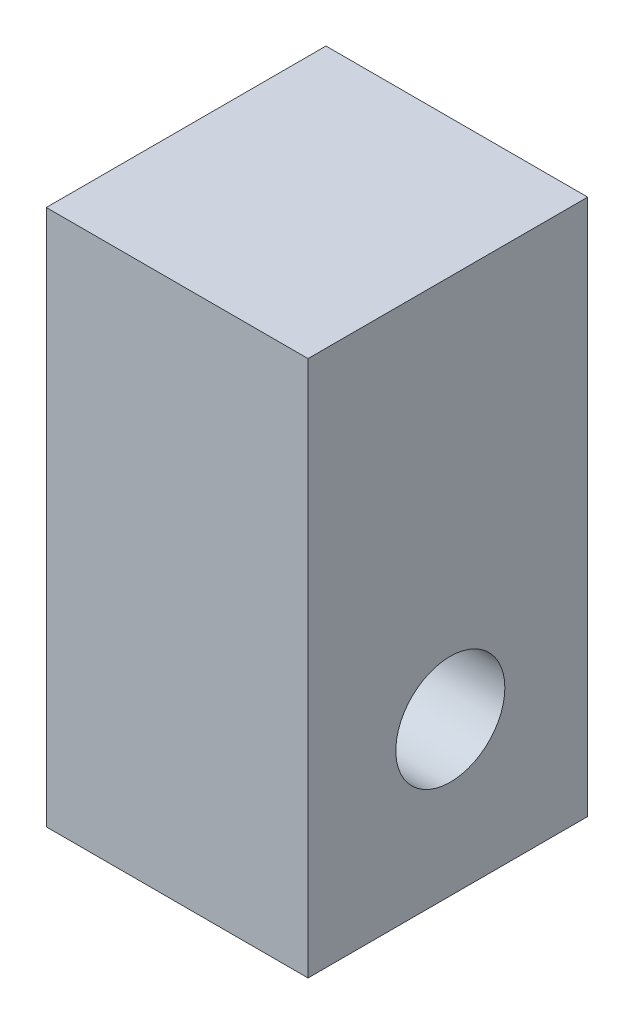
ISO-10303-21;
HEADER;
FILE_DESCRIPTION(('STEP AP214'),'2;1');
FILE_NAME('part.step','',(''),(''),'','','');
FILE_SCHEMA(('AUTOMOTIVE_DESIGN { 1 0 10303 214 1 1 1 1 }'));
ENDSEC;
DATA;
#1=APPLICATION_CONTEXT('core data for automotive mechanical design processes');
#2=APPLICATION_PROTOCOL_DEFINITION('international standard','automotive_design',2000,#1);
#3=PRODUCT_CONTEXT('',#1,'mechanical');
#4=PRODUCT('Part','Part','',(#3));
#5=PRODUCT_RELATED_PRODUCT_CATEGORY('part','',(#4));
#6=PRODUCT_DEFINITION_FORMATION('','',#4);
#7=PRODUCT_DEFINITION_CONTEXT('part definition',#1,'design');
#8=PRODUCT_DEFINITION('design','',#6,#7);
#9=PRODUCT_DEFINITION_SHAPE('','',#8);
#10=(LENGTH_UNIT() NAMED_UNIT(*) SI_UNIT(.MILLI.,.METRE.));
#11=(NAMED_UNIT(*) PLANE_ANGLE_UNIT() SI_UNIT($,.RADIAN.));
#12=(NAMED_UNIT(*) SI_UNIT($,.STERADIAN.) SOLID_ANGLE_UNIT());
#13=UNCERTAINTY_MEASURE_WITH_UNIT(LENGTH_MEASURE(1.E-05),#10,'distance_accuracy_value','');
#14=(GEOMETRIC_REPRESENTATION_CONTEXT(3) GLOBAL_UNCERTAINTY_ASSIGNED_CONTEXT((#13)) GLOBAL_UNIT_ASSIGNED_CONTEXT((#10,
#11,#12)) REPRESENTATION_CONTEXT('',''));
#15=CARTESIAN_POINT('',(0.,0.,0.));
#16=DIRECTION('',(0.,0.,1.));
#17=DIRECTION('',(1.,0.,0.));
#18=AXIS2_PLACEMENT_3D('',#15,#16,#17);
#19=CARTESIAN_POINT('',(-4.01,300.162147955684,27.3930893356429));
#20=DIRECTION('',(0.,1.,0.));
#21=DIRECTION('',(0.,0.,1.));
#22=AXIS2_PLACEMENT_3D('',#19,#20,#21);
#23=PLANE('',#22);
#24=DIRECTION('',(1.,0.,0.));
#25=VECTOR('',#24,1.);
#26=CARTESIAN_POINT('',(8.,300.162147955684,27.4030893356429));
#27=LINE('',#26,#25);
#28=CARTESIAN_POINT('',(-4.,300.162147955684,27.4030893356429));
#29=VERTEX_POINT('',#28);
#30=CARTESIAN_POINT('',(20.,300.162147955684,27.4030893356429));
#31=VERTEX_POINT('',#30);
#32=EDGE_CURVE('E121',#29,#31,#27,.T.);
#33=ORIENTED_EDGE('',*,*,#32,.F.);
#34=DIRECTION('',(0.,0.,-1.));
#35=VECTOR('',#34,1.);
#36=CARTESIAN_POINT('',(-4.,300.162147955684,40.2260139648698));
#37=LINE('',#36,#35);
#38=CARTESIAN_POINT('',(-4.,300.162147955684,53.0489385940967));
#39=VERTEX_POINT('',#38);
#40=EDGE_CURVE('E138',#39,#29,#37,.T.);
#41=ORIENTED_EDGE('',*,*,#40,.F.);
#42=DIRECTION('',(-1.,0.,0.));
#43=VECTOR('',#42,1.);
#44=CARTESIAN_POINT('',(8.,300.162147955684,53.0489385940967));
#45=LINE('',#44,#43);
#46=CARTESIAN_POINT('',(20.,300.162147955684,53.0489385940967));
#47=VERTEX_POINT('',#46);
#48=EDGE_CURVE('E99',#47,#39,#45,.T.);
#49=ORIENTED_EDGE('',*,*,#48,.F.);
#50=DIRECTION('',(0.,0.,1.));
#51=VECTOR('',#50,1.);
#52=CARTESIAN_POINT('',(20.,300.162147955684,40.2260139648698));
#53=LINE('',#52,#51);
#54=EDGE_CURVE('E100',#31,#47,#53,.T.);
#55=ORIENTED_EDGE('',*,*,#54,.F.);
#56=EDGE_LOOP('',(#33,#41,#49,#55));
#57=FACE_BOUND('',#56,.T.);
#58=ADVANCED_FACE('F16',(#57),#23,.T.);
#59=CARTESIAN_POINT('',(-4.,265.,40.));
#60=DIRECTION('',(1.,0.,0.));
#61=DIRECTION('',(0.,0.,-1.));
#62=AXIS2_PLACEMENT_3D('',#59,#60,#61);
#63=CYLINDRICAL_SURFACE('',#62,5.);
#64=CARTESIAN_POINT('',(-4.,265.,40.));
#65=DIRECTION('',(1.,0.,0.));
#66=DIRECTION('',(0.,0.,-1.));
#67=AXIS2_PLACEMENT_3D('',#64,#65,#66);
#68=CIRCLE('',#67,5.);
#69=CARTESIAN_POINT('',(-4.,265.,35.));
#70=VERTEX_POINT('',#69);
#71=EDGE_CURVE('E23',#70,#70,#68,.T.);
#72=ORIENTED_EDGE('',*,*,#71,.F.);
#73=EDGE_LOOP('',(#72));
#74=FACE_BOUND('',#73,.T.);
#75=CARTESIAN_POINT('',(4.,265.,40.));
#76=DIRECTION('',(1.,0.,0.));
#77=DIRECTION('',(0.,0.,-1.));
#78=AXIS2_PLACEMENT_3D('',#75,#76,#77);
#79=CIRCLE('',#78,5.);
#80=CARTESIAN_POINT('',(4.,265.,35.));
#81=VERTEX_POINT('',#80);
#82=EDGE_CURVE('E69',#81,#81,#79,.F.);
#83=ORIENTED_EDGE('',*,*,#82,.F.);
#84=EDGE_LOOP('',(#83));
#85=FACE_BOUND('',#84,.T.);
#86=ADVANCED_FACE('F250',(#74,#85),#63,.F.);
#87=CARTESIAN_POINT('',(-4.,300.172147955684,27.3930893356429));
#88=DIRECTION('',(-1.,0.,0.));
#89=DIRECTION('',(0.,-1.,0.));
#90=AXIS2_PLACEMENT_3D('',#87,#88,#89);
#91=PLANE('',#90);
#92=ORIENTED_EDGE('',*,*,#71,.T.);
#93=EDGE_LOOP('',(#92));
#94=FACE_BOUND('',#93,.T.);
#95=DIRECTION('',(0.,-1.,0.));
#96=VECTOR('',#95,1.);
#97=CARTESIAN_POINT('',(-4.,275.567230689508,53.0489385940967));
#98=LINE('',#97,#96);
#99=CARTESIAN_POINT('',(-4.,250.972313423332,53.0489385940967));
#100=VERTEX_POINT('',#99);
#101=EDGE_CURVE('E133',#39,#100,#98,.T.);
#102=ORIENTED_EDGE('',*,*,#101,.F.);
#103=ORIENTED_EDGE('',*,*,#40,.T.);
#104=DIRECTION('',(0.,1.,0.));
#105=VECTOR('',#104,1.);
#106=CARTESIAN_POINT('',(-4.,275.567230689508,27.4030893356429));
#107=LINE('',#106,#105);
#108=CARTESIAN_POINT('',(-4.,250.972313423332,27.4030893356429));
#109=VERTEX_POINT('',#108);
#110=EDGE_CURVE('E111',#109,#29,#107,.T.);
#111=ORIENTED_EDGE('',*,*,#110,.F.);
#112=DIRECTION('',(0.,0.,-1.));
#113=VECTOR('',#112,1.);
#114=CARTESIAN_POINT('',(-4.,250.972313423332,40.2260139648698));
#115=LINE('',#114,#113);
#116=EDGE_CURVE('E116',#100,#109,#115,.T.);
#117=ORIENTED_EDGE('',*,*,#116,.F.);
#118=EDGE_LOOP('',(#102,#103,#111,#117));
#119=FACE_BOUND('',#118,.T.);
#120=ADVANCED_FACE('F242',(#94,#119),#91,.T.);
#121=CARTESIAN_POINT('',(-4.01,250.962313423332,27.4030893356429));
#122=DIRECTION('',(0.,0.,-1.));
#123=DIRECTION('',(0.,1.,0.));
#124=AXIS2_PLACEMENT_3D('',#121,#122,#123);
#125=PLANE('',#124);
#126=DIRECTION('',(1.,0.,0.));
#127=VECTOR('',#126,1.);
#128=CARTESIAN_POINT('',(8.,250.972313423332,27.4030893356429));
#129=LINE('',#128,#127);
#130=CARTESIAN_POINT('',(20.,250.972313423332,27.4030893356429));
#131=VERTEX_POINT('',#130);
#132=EDGE_CURVE('E105',#109,#131,#129,.T.);
#133=ORIENTED_EDGE('',*,*,#132,.F.);
#134=ORIENTED_EDGE('',*,*,#110,.T.);
#135=ORIENTED_EDGE('',*,*,#32,.T.);
#136=DIRECTION('',(0.,1.,0.));
#137=VECTOR('',#136,1.);
#138=CARTESIAN_POINT('',(20.,275.567230689508,27.4030893356429));
#139=LINE('',#138,#137);
#140=EDGE_CURVE('E108',#131,#31,#139,.T.);
#141=ORIENTED_EDGE('',*,*,#140,.F.);
#142=EDGE_LOOP('',(#133,#134,#135,#141));
#143=FACE_BOUND('',#142,.T.);
#144=ADVANCED_FACE('F208',(#143),#125,.T.);
#145=CARTESIAN_POINT('',(20.,250.962313423332,27.3930893356429));
#146=DIRECTION('',(1.,0.,0.));
#147=DIRECTION('',(0.,1.,0.));
#148=AXIS2_PLACEMENT_3D('',#145,#146,#147);
#149=PLANE('',#148);
#150=CARTESIAN_POINT('',(20.,265.,40.));
#151=DIRECTION('',(1.,0.,0.));
#152=DIRECTION('',(0.,0.,-1.));
#153=AXIS2_PLACEMENT_3D('',#150,#151,#152);
#154=CIRCLE('',#153,5.);
#155=CARTESIAN_POINT('',(20.,265.,35.));
#156=VERTEX_POINT('',#155);
#157=EDGE_CURVE('E88',#156,#156,#154,.T.);
#158=ORIENTED_EDGE('',*,*,#157,.F.);
#159=EDGE_LOOP('',(#158));
#160=FACE_BOUND('',#159,.T.);
#161=DIRECTION('',(0.,1.,0.));
#162=VECTOR('',#161,1.);
#163=CARTESIAN_POINT('',(20.,275.567230689508,53.0489385940967));
#164=LINE('',#163,#162);
#165=CARTESIAN_POINT('',(20.,250.972313423332,53.0489385940967));
#166=VERTEX_POINT('',#165);
#167=EDGE_CURVE('E96',#166,#47,#164,.T.);
#168=ORIENTED_EDGE('',*,*,#167,.F.);
#169=DIRECTION('',(0.,0.,1.));
#170=VECTOR('',#169,1.);
#171=CARTESIAN_POINT('',(20.,250.972313423332,40.2260139648698));
#172=LINE('',#171,#170);
#173=EDGE_CURVE('E93',#131,#166,#172,.T.);
#174=ORIENTED_EDGE('',*,*,#173,.F.);
#175=ORIENTED_EDGE('',*,*,#140,.T.);
#176=ORIENTED_EDGE('',*,*,#54,.T.);
#177=EDGE_LOOP('',(#168,#174,#175,#176));
#178=FACE_BOUND('',#177,.T.);
#179=ADVANCED_FACE('F204',(#160,#178),#149,.T.);
#180=CARTESIAN_POINT('',(-4.01,300.172147955684,53.0489385940967));
#181=DIRECTION('',(0.,0.,1.));
#182=DIRECTION('',(0.,-1.,0.));
#183=AXIS2_PLACEMENT_3D('',#180,#181,#182);
#184=PLANE('',#183);
#185=ORIENTED_EDGE('',*,*,#48,.T.);
#186=ORIENTED_EDGE('',*,*,#101,.T.);
#187=DIRECTION('',(-1.,0.,0.));
#188=VECTOR('',#187,1.);
#189=CARTESIAN_POINT('',(8.,250.972313423332,53.0489385940967));
#190=LINE('',#189,#188);
#191=CARTESIAN_POINT('',(4.,250.972313423332,53.0489385940967));
#192=VERTEX_POINT('',#191);
#193=EDGE_CURVE('E126',#192,#100,#190,.T.);
#194=ORIENTED_EDGE('',*,*,#193,.F.);
#195=DIRECTION('',(-1.,0.,0.));
#196=VECTOR('',#195,1.);
#197=CARTESIAN_POINT('',(8.,250.972313423332,53.0489385940967));
#198=LINE('',#197,#196);
#199=CARTESIAN_POINT('',(12.,250.972313423332,53.0489385940967));
#200=VERTEX_POINT('',#199);
#201=EDGE_CURVE('E65',#200,#192,#198,.T.);
#202=ORIENTED_EDGE('',*,*,#201,.F.);
#203=DIRECTION('',(-1.,0.,0.));
#204=VECTOR('',#203,1.);
#205=CARTESIAN_POINT('',(8.,250.972313423332,53.0489385940967));
#206=LINE('',#205,#204);
#207=EDGE_CURVE('E89',#166,#200,#206,.T.);
#208=ORIENTED_EDGE('',*,*,#207,.F.);
#209=ORIENTED_EDGE('',*,*,#167,.T.);
#210=EDGE_LOOP('',(#185,#186,#194,#202,#208,#209));
#211=FACE_BOUND('',#210,.T.);
#212=ADVANCED_FACE('F207',(#211),#184,.T.);
#213=CARTESIAN_POINT('',(12.,265.,40.));
#214=DIRECTION('',(1.,0.,0.));
#215=DIRECTION('',(0.,0.,-1.));
#216=AXIS2_PLACEMENT_3D('',#213,#214,#215);
#217=CYLINDRICAL_SURFACE('',#216,5.);
#218=CARTESIAN_POINT('',(12.,265.,40.));
#219=DIRECTION('',(1.,0.,0.));
#220=DIRECTION('',(0.,0.,-1.));
#221=AXIS2_PLACEMENT_3D('',#218,#219,#220);
#222=CIRCLE('',#221,5.);
#223=CARTESIAN_POINT('',(12.,265.,35.));
#224=VERTEX_POINT('',#223);
#225=EDGE_CURVE('E77',#224,#224,#222,.T.);
#226=ORIENTED_EDGE('',*,*,#225,.F.);
#227=EDGE_LOOP('',(#226));
#228=FACE_BOUND('',#227,.T.);
#229=ORIENTED_EDGE('',*,*,#157,.T.);
#230=EDGE_LOOP('',(#229));
#231=FACE_BOUND('',#230,.T.);
#232=ADVANCED_FACE('F187',(#228,#231),#217,.F.);
#233=CARTESIAN_POINT('',(4.,250.972313423332,53.0489385940967));
#234=CARTESIAN_POINT('',(12.,250.972313423332,53.0489385940967));
#235=CARTESIAN_POINT('',(4.,251.094790735295,52.8726110395644));
#236=CARTESIAN_POINT('',(12.,251.094790735295,52.8726110395644));
#237=CARTESIAN_POINT('',(4.,251.355380041527,52.5270325787047));
#238=CARTESIAN_POINT('',(12.,251.355380041527,52.5270325787047));
#239=CARTESIAN_POINT('',(4.,251.793169050558,52.029895285908));
#240=CARTESIAN_POINT('',(12.,251.793169050558,52.029895285908));
#241=CARTESIAN_POINT('',(4.,252.472232609889,51.410201039541));
#242=CARTESIAN_POINT('',(12.,252.472232609889,51.410201039541));
#243=CARTESIAN_POINT('',(4.,253.489502120393,50.711823415706));
#244=CARTESIAN_POINT('',(12.,253.489502120393,50.711823415706));
#245=CARTESIAN_POINT('',(4.,254.68615991058,50.0946414134092));
#246=CARTESIAN_POINT('',(12.,254.68615991058,50.0946414134092));
#247=CARTESIAN_POINT('',(4.,256.069380306183,49.5619023118962));
#248=CARTESIAN_POINT('',(12.,256.069380306183,49.5619023118962));
#249=CARTESIAN_POINT('',(4.,257.63214241845,49.1104282813444));
#250=CARTESIAN_POINT('',(12.,257.63214241845,49.1104282813444));
#251=CARTESIAN_POINT('',(4.,259.358756991625,48.7331179722495));
#252=CARTESIAN_POINT('',(12.,259.358756991625,48.7331179722495));
#253=CARTESIAN_POINT('',(4.,261.232297648932,48.4223100831971));
#254=CARTESIAN_POINT('',(12.,261.232297648932,48.4223100831971));
#255=CARTESIAN_POINT('',(4.,262.837142115883,48.2216474276827));
#256=CARTESIAN_POINT('',(12.,262.837142115883,48.2216474276827));
#257=CARTESIAN_POINT('',(4.,264.096266137086,48.0962669014714));
#258=CARTESIAN_POINT('',(12.,264.096266137086,48.0962669014714));
#259=CARTESIAN_POINT('',(4.,264.959940571983,48.0236598518995));
#260=CARTESIAN_POINT('',(12.,264.959940571983,48.0236598518995));
#261=CARTESIAN_POINT('',(4.,265.397842686042,47.9901014509932));
#262=CARTESIAN_POINT('',(12.,265.397842686042,47.9901014509932));
#263=B_SPLINE_SURFACE_WITH_KNOTS('',5,1,((#233,#234),(#235,#236),(#237,#238),(#239,#240),(#241,
#242),(#243,#244),(#245,#246),(#247,#248),(#249,#250),(#251,#252),(#253,#254),(#255,#256),(#257,
#258),(#259,#260),(#261,#262)),.UNSPECIFIED.,.F.,.F.,.F.,(6,1,1,1,1,1,1,1,1,1,6),(2,2),(-1.,
-0.9,-0.8,-0.7,-0.6,-0.5,-0.4,-0.3,-0.2,-0.1,0.),(0.,0.8),.UNSPECIFIED.);
#264=CARTESIAN_POINT('',(12.,250.972313423332,53.0489385940967));
#265=CARTESIAN_POINT('',(12.,251.060682972925,52.9216961978627));
#266=CARTESIAN_POINT('',(12.,251.153382064024,52.7974997491512));
#267=CARTESIAN_POINT('',(12.,251.346506239264,52.5556655474179));
#268=CARTESIAN_POINT('',(12.,251.446915566369,52.4380152230266));
#269=CARTESIAN_POINT('',(12.,251.654822399127,52.209300361784));
#270=CARTESIAN_POINT('',(12.,251.762315594955,52.0982318972467));
#271=CARTESIAN_POINT('',(12.,251.981294151887,51.8850627086551));
#272=CARTESIAN_POINT('',(12.,252.092640457815,51.7828188267141));
#273=CARTESIAN_POINT('',(12.,252.320869453498,51.5846116264991));
#274=CARTESIAN_POINT('',(12.,252.437754638725,51.488651186426));
#275=CARTESIAN_POINT('',(12.,252.67640255375,51.3029652942458));
#276=CARTESIAN_POINT('',(12.,252.79816636025,51.2132412305768));
#277=CARTESIAN_POINT('',(12.,253.096439321411,51.0045770461902));
#278=CARTESIAN_POINT('',(12.,253.27504383675,50.8886244329777));
#279=CARTESIAN_POINT('',(12.,253.63919572653,50.6681441930101));
#280=CARTESIAN_POINT('',(12.,253.824745164665,50.5636199989915));
#281=CARTESIAN_POINT('',(12.,254.201430755041,50.3651857258049));
#282=CARTESIAN_POINT('',(12.,254.392567388068,50.2712765634776));
#283=CARTESIAN_POINT('',(12.,254.783040261384,50.0913926825453));
#284=CARTESIAN_POINT('',(12.,254.982463709501,50.0056083198371));
#285=CARTESIAN_POINT('',(12.,255.384871844638,49.8430227421529));
#286=CARTESIAN_POINT('',(12.,255.587855805788,49.7662197201073));
#287=CARTESIAN_POINT('',(12.,255.996611200248,49.6205249361439));
#288=CARTESIAN_POINT('',(12.,256.202382470507,49.5516327136812));
#289=CARTESIAN_POINT('',(12.,256.708817873633,49.3914474400918));
#290=CARTESIAN_POINT('',(12.,257.010681661162,49.3039515769273));
#291=CARTESIAN_POINT('',(12.,257.617666236751,49.1409318064363));
#292=CARTESIAN_POINT('',(12.,257.922787882907,49.0654111406831));
#293=CARTESIAN_POINT('',(12.,258.535601714421,48.9242921352921));
#294=CARTESIAN_POINT('',(12.,258.843296046906,48.8587031915117));
#295=CARTESIAN_POINT('',(12.,259.460648861408,48.7358960079846));
#296=CARTESIAN_POINT('',(12.,259.770308969302,48.6786860127979));
#297=CARTESIAN_POINT('',(12.,260.391066437594,48.5714454244102));
#298=CARTESIAN_POINT('',(12.,260.702164593641,48.5214194679024));
#299=CARTESIAN_POINT('',(12.,261.305452326418,48.430617607594));
#300=CARTESIAN_POINT('',(12.,261.597584195367,48.3894554868615));
#301=CARTESIAN_POINT('',(12.,262.182320666874,48.3120272370915));
#302=CARTESIAN_POINT('',(12.,262.47492489644,48.2757582790387));
#303=CARTESIAN_POINT('',(12.,263.06020987463,48.2076512739973));
#304=CARTESIAN_POINT('',(12.,263.352889876813,48.1758067842325));
#305=CARTESIAN_POINT('',(12.,263.937939114653,48.1161707132322));
#306=CARTESIAN_POINT('',(12.,264.230307366713,48.0883694346914));
#307=CARTESIAN_POINT('',(12.,264.814357111328,48.0365278746285));
#308=CARTESIAN_POINT('',(12.,265.106037475142,48.0124749000382));
#309=CARTESIAN_POINT('',(12.,265.397842686042,47.9901014509932));
#310=B_SPLINE_CURVE_WITH_KNOTS('',3,(#264,#265,#266,#267,#268,#269,#270,#271,#272,#273,#274,
#275,#276,#277,#278,#279,#280,#281,#282,#283,#284,#285,#286,#287,#288,#289,#290,#291,#292,#293,
#294,#295,#296,#297,#298,#299,#300,#301,#302,#303,#304,#305,#306,#307,#308,#309),.UNSPECIFIED.,
.F.,.F.,(4,2,2,2,2,2,2,2,2,2,2,2,2,2,2,2,2,2,2,2,2,2,4),(0.,0.46461922085901,0.928312976378586,
1.39172717961576,1.84498878019078,2.29845657051804,2.75202499757094,3.39035859100454,
4.02888339600757,4.66746330956328,5.31849141708117,5.96938830981534,6.62024728989887,
7.56278730010313,8.50558201307747,9.44926315361619,10.3938666898599,11.3390771743827,
12.2240848479435,13.1085786353022,13.9917706396458,14.8728081545285,15.7507941084636),.UNSPECIFIED.);
#311=CARTESIAN_POINT('',(12.,265.397842686042,47.9901014509932));
#312=VERTEX_POINT('',#311);
#313=EDGE_CURVE('E174',#200,#312,#310,.T.);
#314=CARTESIAN_POINT('',(4.,265.397842686042,47.9901014509932));
#315=CARTESIAN_POINT('',(4.,265.093385081342,48.0134466642958));
#316=CARTESIAN_POINT('',(4.,264.78906281593,48.0386180078685));
#317=CARTESIAN_POINT('',(4.,264.180366358286,48.0929791020582));
#318=CARTESIAN_POINT('',(4.,263.875992644722,48.1221742015023));
#319=CARTESIAN_POINT('',(4.,263.267449380577,48.1849127133049));
#320=CARTESIAN_POINT('',(4.,262.963280178713,48.2184595266914));
#321=CARTESIAN_POINT('',(4.,262.355416010964,48.2903404528707));
#322=CARTESIAN_POINT('',(4.,262.051721208209,48.3286759513105));
#323=CARTESIAN_POINT('',(4.,261.439562764455,48.4114311526202));
#324=CARTESIAN_POINT('',(4.,261.131112230466,48.4559483672944));
#325=CARTESIAN_POINT('',(4.,260.515273564281,48.551267681371));
#326=CARTESIAN_POINT('',(4.,260.207885136982,48.6020678614411));
#327=CARTESIAN_POINT('',(4.,259.594506230776,48.7109206335245));
#328=CARTESIAN_POINT('',(4.,259.288515271012,48.7689704996519));
#329=CARTESIAN_POINT('',(4.,258.678305782694,48.893575254759));
#330=CARTESIAN_POINT('',(4.,258.37408695496,48.9601286619051));
#331=CARTESIAN_POINT('',(4.,257.857685449615,49.0821666183739));
#332=CARTESIAN_POINT('',(4.,257.64490044595,49.1351009311991));
#333=CARTESIAN_POINT('',(4.,257.220815287827,49.2466826627867));
#334=CARTESIAN_POINT('',(4.,257.009515196204,49.3053303217706));
#335=CARTESIAN_POINT('',(4.,256.588782893065,49.4291541001055));
#336=CARTESIAN_POINT('',(4.,256.379351043239,49.4943314549574));
#337=CARTESIAN_POINT('',(4.,255.963481239759,49.6319584939402));
#338=CARTESIAN_POINT('',(4.,255.757036913766,49.7043888135543));
#339=CARTESIAN_POINT('',(4.,255.347314113107,49.8576880923369));
#340=CARTESIAN_POINT('',(4.,255.144035255743,49.938556022174));
#341=CARTESIAN_POINT('',(4.,254.741572666274,50.1098200286373));
#342=CARTESIAN_POINT('',(4.,254.542387900089,50.2002136630382));
#343=CARTESIAN_POINT('',(4.,254.127279994585,50.4022930005574));
#344=CARTESIAN_POINT('',(4.,253.911960084596,50.5152286902938));
#345=CARTESIAN_POINT('',(4.,253.489554500752,50.7555541161977));
#346=CARTESIAN_POINT('',(4.,253.282467045639,50.8829407023826));
#347=CARTESIAN_POINT('',(4.,252.879288427866,51.1528402056722));
#348=CARTESIAN_POINT('',(4.,252.683164121445,51.2953032884399));
#349=CARTESIAN_POINT('',(4.,252.30374696541,51.5962801723038));
#350=CARTESIAN_POINT('',(4.,252.120447966668,51.7547861911383));
#351=CARTESIAN_POINT('',(4.,251.764870834264,52.0922261231978));
#352=CARTESIAN_POINT('',(4.,251.592974647442,52.2715665833476));
#353=CARTESIAN_POINT('',(4.,251.349224841442,52.5533482842468));
#354=CARTESIAN_POINT('',(4.,251.270169517503,52.6496245501172));
#355=CARTESIAN_POINT('',(4.,251.117251073865,52.8462547934187));
#356=CARTESIAN_POINT('',(4.,251.043389347759,52.9466098539967));
#357=CARTESIAN_POINT('',(4.,250.972313423332,53.0489385940967));
#358=B_SPLINE_CURVE_WITH_KNOTS('',3,(#314,#315,#316,#317,#318,#319,#320,#321,#322,#323,#324,
#325,#326,#327,#328,#329,#330,#331,#332,#333,#334,#335,#336,#337,#338,#339,#340,#341,#342,#343,
#344,#345,#346,#347,#348,#349,#350,#351,#352,#353,#354,#355,#356,#357),.UNSPECIFIED.,.F.,.F.,(4,
2,2,2,2,2,2,2,2,2,2,2,2,2,2,2,2,2,2,2,2,4),(0.,0.916055376318095,1.83334043691703,
2.75134675875067,3.66961933159498,4.6045022364523,5.53910025364921,6.4733479135667,
7.40743299224568,8.06517813303569,8.72295094111293,9.38084844402943,10.0370340424195,
10.6931396839875,11.3490775188272,12.077992020182,12.8067479381551,13.5331660940599,
14.2592335457194,15.0031589353868,15.376729197689,15.7503993202742),.UNSPECIFIED.);
#359=CARTESIAN_POINT('',(4.,265.397842686042,47.9901014509932));
#360=VERTEX_POINT('',#359);
#361=EDGE_CURVE('E59',#360,#192,#358,.T.);
#362=DIRECTION('',(-1.,0.,0.));
#363=VECTOR('',#362,1.);
#364=CARTESIAN_POINT('',(8.,265.397842686042,47.9901014509932));
#365=LINE('',#364,#363);
#366=EDGE_CURVE('E64',#312,#360,#365,.T.);
#367=ORIENTED_EDGE('',*,*,#313,.F.);
#368=ORIENTED_EDGE('',*,*,#201,.T.);
#369=ORIENTED_EDGE('',*,*,#361,.F.);
#370=ORIENTED_EDGE('',*,*,#366,.F.);
#371=EDGE_LOOP('',(#367,#368,#369,#370));
#372=FACE_BOUND('',#371,.T.);
#373=ADVANCED_FACE('F62',(#372),#263,.T.);
#374=CARTESIAN_POINT('',(4.,250.962313423332,27.9041363123494));
#375=DIRECTION('',(1.,0.,0.));
#376=DIRECTION('',(0.,1.,0.));
#377=AXIS2_PLACEMENT_3D('',#374,#375,#376);
#378=PLANE('',#377);
#379=ORIENTED_EDGE('',*,*,#82,.T.);
#380=EDGE_LOOP('',(#379));
#381=FACE_BOUND('',#380,.T.);
#382=DIRECTION('',(0.,0.,1.));
#383=VECTOR('',#382,1.);
#384=CARTESIAN_POINT('',(4.,250.972313423332,40.2260139648698));
#385=LINE('',#384,#383);
#386=CARTESIAN_POINT('',(4.,250.972313423332,27.9141363123494));
#387=VERTEX_POINT('',#386);
#388=EDGE_CURVE('E86',#387,#192,#385,.T.);
#389=ORIENTED_EDGE('',*,*,#388,.F.);
#390=CARTESIAN_POINT('',(4.,265.140230113327,32.0012291247144));
#391=CARTESIAN_POINT('',(4.,264.843405105679,31.9880701521189));
#392=CARTESIAN_POINT('',(4.,264.546652799238,31.9731775767956));
#393=CARTESIAN_POINT('',(4.,263.953017594738,31.9396021909287));
#394=CARTESIAN_POINT('',(4.,263.656134945253,31.9209149987018));
#395=CARTESIAN_POINT('',(4.,263.062451844927,31.8794424582638));
#396=CARTESIAN_POINT('',(4.,262.765651585923,31.8566543431628));
#397=CARTESIAN_POINT('',(4.,262.172355265388,31.8065748721459));
#398=CARTESIAN_POINT('',(4.,261.875859297016,31.7792824061602));
#399=CARTESIAN_POINT('',(4.,261.279547946937,31.7193034340151));
#400=CARTESIAN_POINT('',(4.,260.979739059687,31.6865519135707));
#401=CARTESIAN_POINT('',(4.,260.380887296293,31.6152426211558));
#402=CARTESIAN_POINT('',(4.,260.081844239217,31.5766863804881));
#403=CARTESIAN_POINT('',(4.,259.484784164785,31.4929139964596));
#404=CARTESIAN_POINT('',(4.,259.18676684856,31.4476999974942));
#405=CARTESIAN_POINT('',(4.,258.592042519089,31.3495182572144));
#406=CARTESIAN_POINT('',(4.,258.295335314952,31.2965516866648));
#407=CARTESIAN_POINT('',(4.,257.792942088819,31.1988236127938));
#408=CARTESIAN_POINT('',(4.,257.586799939611,31.1564072215867));
#409=CARTESIAN_POINT('',(4.,257.17560639226,31.0665228075137));
#410=CARTESIAN_POINT('',(4.,256.970555028874,31.0190546246696));
#411=CARTESIAN_POINT('',(4.,256.561828152039,30.9183813384644));
#412=CARTESIAN_POINT('',(4.,256.358152831135,30.8651754492177));
#413=CARTESIAN_POINT('',(4.,255.952807946253,30.7522973228656));
#414=CARTESIAN_POINT('',(4.,255.75113660558,30.692631501151));
#415=CARTESIAN_POINT('',(4.,255.350133946276,30.5659026012287));
#416=CARTESIAN_POINT('',(4.,255.150802440281,30.4988401198509));
#417=CARTESIAN_POINT('',(4.,254.755173761164,30.3563490154317));
#418=CARTESIAN_POINT('',(4.,254.558876146792,30.2809216222817));
#419=CARTESIAN_POINT('',(4.,254.124364582848,30.1018084851753));
#420=CARTESIAN_POINT('',(4.,253.88715767703,29.9956499187372));
#421=CARTESIAN_POINT('',(4.,253.420649320939,29.7672049744085));
#422=CARTESIAN_POINT('',(4.,253.191345992674,29.6449224615663));
#423=CARTESIAN_POINT('',(4.,252.743841219331,29.3831470460986));
#424=CARTESIAN_POINT('',(4.,252.52560221292,29.2437187717325));
#425=CARTESIAN_POINT('',(4.,252.102289616429,28.9462764214088));
#426=CARTESIAN_POINT('',(4.,251.897206512559,28.7882760156699));
#427=CARTESIAN_POINT('',(4.,251.571486906387,28.5112216608651));
#428=CARTESIAN_POINT('',(4.,251.446193876951,28.3976199877214));
#429=CARTESIAN_POINT('',(4.,251.203227148084,28.1620831615034));
#430=CARTESIAN_POINT('',(4.,251.08556910947,28.0401318725629));
#431=CARTESIAN_POINT('',(4.,250.972313423332,27.9141363123494));
#432=B_SPLINE_CURVE_WITH_KNOTS('',3,(#390,#391,#392,#393,#394,#395,#396,#397,#398,#399,#400,
#401,#402,#403,#404,#405,#406,#407,#408,#409,#410,#411,#412,#413,#414,#415,#416,#417,#418,#419,
#420,#421,#422,#423,#424,#425,#426,#427,#428,#429,#430,#431),.UNSPECIFIED.,.F.,.F.,(4,2,2,2,2,2,
2,2,2,2,2,2,2,2,2,2,2,2,2,2,4),(0.,0.891350701424741,1.78373656818481,2.67672679997498,
3.56993743328444,4.47466532374241,5.37915496109418,6.28335390632782,7.18741644338996,
7.81874574660699,8.45009504845519,9.08153093541666,9.71234539455481,10.3431089910099,
10.9737799690559,11.7528693976368,12.5317724101464,13.3078246296577,14.0833091629243,
14.5903375825238,15.0983751247547),.UNSPECIFIED.);
#433=CARTESIAN_POINT('',(4.,265.140230113327,32.0012291247144));
#434=VERTEX_POINT('',#433);
#435=EDGE_CURVE('E75',#434,#387,#432,.T.);
#436=ORIENTED_EDGE('',*,*,#435,.F.);
#437=CARTESIAN_POINT('',(4.,265.,39.9999999999996));
#438=DIRECTION('',(1.,0.,0.));
#439=DIRECTION('',(0.,0.,-1.));
#440=AXIS2_PLACEMENT_3D('',#437,#438,#439);
#441=CIRCLE('',#440,7.99999999999969);
#442=EDGE_CURVE('E72',#360,#434,#441,.F.);
#443=ORIENTED_EDGE('',*,*,#442,.F.);
#444=ORIENTED_EDGE('',*,*,#361,.T.);
#445=EDGE_LOOP('',(#389,#436,#443,#444));
#446=FACE_BOUND('',#445,.T.);
#447=ADVANCED_FACE('F73',(#381,#446),#378,.T.);
#448=CARTESIAN_POINT('',(-4.01,250.972313423332,53.0589385940967));
#449=DIRECTION('',(0.,-1.,0.));
#450=DIRECTION('',(0.,0.,-1.));
#451=AXIS2_PLACEMENT_3D('',#448,#449,#450);
#452=PLANE('',#451);
#453=DIRECTION('',(0.,0.,1.));
#454=VECTOR('',#453,1.);
#455=CARTESIAN_POINT('',(12.,250.972313423332,40.4815374532231));
#456=LINE('',#455,#454);
#457=CARTESIAN_POINT('',(12.,250.972313423332,27.9141363123494));
#458=VERTEX_POINT('',#457);
#459=EDGE_CURVE('E92',#458,#200,#456,.T.);
#460=ORIENTED_EDGE('',*,*,#459,.F.);
#461=DIRECTION('',(1.,0.,0.));
#462=VECTOR('',#461,1.);
#463=CARTESIAN_POINT('',(8.,250.972313423332,27.9141363123494));
#464=LINE('',#463,#462);
#465=EDGE_CURVE('E81',#387,#458,#464,.T.);
#466=ORIENTED_EDGE('',*,*,#465,.F.);
#467=ORIENTED_EDGE('',*,*,#388,.T.);
#468=ORIENTED_EDGE('',*,*,#193,.T.);
#469=ORIENTED_EDGE('',*,*,#116,.T.);
#470=ORIENTED_EDGE('',*,*,#132,.T.);
#471=ORIENTED_EDGE('',*,*,#173,.T.);
#472=ORIENTED_EDGE('',*,*,#207,.T.);
#473=EDGE_LOOP('',(#460,#466,#467,#468,#469,#470,#471,#472));
#474=FACE_BOUND('',#473,.T.);
#475=ADVANCED_FACE('F170',(#474),#452,.T.);
#476=CARTESIAN_POINT('',(12.,273.133576813266,27.9041363123494));
#477=DIRECTION('',(-1.,0.,0.));
#478=DIRECTION('',(0.,-1.,0.));
#479=AXIS2_PLACEMENT_3D('',#476,#477,#478);
#480=PLANE('',#479);
#481=ORIENTED_EDGE('',*,*,#225,.T.);
#482=EDGE_LOOP('',(#481));
#483=FACE_BOUND('',#482,.T.);
#484=ORIENTED_EDGE('',*,*,#459,.T.);
#485=ORIENTED_EDGE('',*,*,#313,.T.);
#486=CARTESIAN_POINT('',(12.,265.,39.9999999999996));
#487=DIRECTION('',(1.,0.,0.));
#488=DIRECTION('',(0.,0.,-1.));
#489=AXIS2_PLACEMENT_3D('',#486,#487,#488);
#490=CIRCLE('',#489,7.99999999999969);
#491=CARTESIAN_POINT('',(12.,265.140230113327,32.0012291247144));
#492=VERTEX_POINT('',#491);
#493=EDGE_CURVE('E38',#492,#312,#490,.T.);
#494=ORIENTED_EDGE('',*,*,#493,.F.);
#495=CARTESIAN_POINT('',(12.,250.972313423332,27.9141363123494));
#496=CARTESIAN_POINT('',(12.,251.086115079127,28.0407452427827));
#497=CARTESIAN_POINT('',(12.,251.204379500439,28.1632799333302));
#498=CARTESIAN_POINT('',(12.,251.448570944885,28.3998438558068));
#499=CARTESIAN_POINT('',(12.,251.574478272528,28.5138933939934));
#500=CARTESIAN_POINT('',(12.,251.833172305821,28.7336782288412));
#501=CARTESIAN_POINT('',(12.,251.96595398439,28.8394194626262));
#502=CARTESIAN_POINT('',(12.,252.234819078371,29.0407259104765));
#503=CARTESIAN_POINT('',(12.,252.370780843951,29.1364540595845));
#504=CARTESIAN_POINT('',(12.,252.647799210918,29.3203870341556));
#505=CARTESIAN_POINT('',(12.,252.788858619866,29.4085876210286));
#506=CARTESIAN_POINT('',(12.,253.07528699532,29.5777305451083));
#507=CARTESIAN_POINT('',(12.,253.220656910399,29.6586712686933));
#508=CARTESIAN_POINT('',(12.,253.597768960748,29.8572274030407));
#509=CARTESIAN_POINT('',(12.,253.832130557371,29.9698840509883));
#510=CARTESIAN_POINT('',(12.,254.307569781767,30.1801086202697));
#511=CARTESIAN_POINT('',(12.,254.548650358866,30.2776697882346));
#512=CARTESIAN_POINT('',(12.,255.035772969812,30.4595894920229));
#513=CARTESIAN_POINT('',(12.,255.281816231789,30.5439447133346));
#514=CARTESIAN_POINT('',(12.,255.781866364772,30.702686939732));
#515=CARTESIAN_POINT('',(12.,256.035937097601,30.7768708868832));
#516=CARTESIAN_POINT('',(12.,256.546676104061,30.9152089565565));
#517=CARTESIAN_POINT('',(12.,256.803343446398,30.9793665481734));
#518=CARTESIAN_POINT('',(12.,257.31862868305,31.0991709764502));
#519=CARTESIAN_POINT('',(12.,257.57724649907,31.1548181528388));
#520=CARTESIAN_POINT('',(12.,258.143486643439,31.2683736528558));
#521=CARTESIAN_POINT('',(12.,258.45139951154,31.3248256860959));
#522=CARTESIAN_POINT('',(12.,259.068690124957,31.4291715450029));
#523=CARTESIAN_POINT('',(12.,259.378068028468,31.4770644237672));
#524=CARTESIAN_POINT('',(12.,259.997959193874,31.5655601193164));
#525=CARTESIAN_POINT('',(12.,260.308472792513,31.6061605583869));
#526=CARTESIAN_POINT('',(12.,260.930340180608,31.6810470297385));
#527=CARTESIAN_POINT('',(12.,261.241694175904,31.715331338826));
#528=CARTESIAN_POINT('',(12.,261.851764186387,31.7770034272398));
#529=CARTESIAN_POINT('',(12.,262.150457082903,31.8046217607096));
#530=CARTESIAN_POINT('',(12.,262.748148962678,31.8552749277104));
#531=CARTESIAN_POINT('',(12.,263.047147843137,31.8783109809395));
#532=CARTESIAN_POINT('',(12.,263.64522120437,31.920212345871));
#533=CARTESIAN_POINT('',(12.,263.944295479211,31.9390806198433));
#534=CARTESIAN_POINT('',(12.,264.542298815638,31.9729587893631));
#535=CARTESIAN_POINT('',(12.,264.841227612557,31.9879733423554));
#536=CARTESIAN_POINT('',(12.,265.140230113327,32.0012291247144));
#537=B_SPLINE_CURVE_WITH_KNOTS('',3,(#495,#496,#497,#498,#499,#500,#501,#502,#503,#504,#505,
#506,#507,#508,#509,#510,#511,#512,#513,#514,#515,#516,#517,#518,#519,#520,#521,#522,#523,#524,
#525,#526,#527,#528,#529,#530,#531,#532,#533,#534,#535,#536),.UNSPECIFIED.,.F.,.F.,(4,2,2,2,2,2,
2,2,2,2,2,2,2,2,2,2,2,2,2,2,4),(0.,0.510536090121038,1.01980822537244,1.52871306023074,
2.02729259757632,2.52615104598859,3.02512010037914,3.80455841123374,4.58434442278095,
5.36432583724191,6.1581245336785,6.95164796668699,7.74513971463918,8.68412553106904,
9.62321516364154,10.5626104346031,11.5022616170861,12.4021242699093,13.3017470784443,
14.2007284032788,15.0986180862175),.UNSPECIFIED.);
#538=EDGE_CURVE('E29',#458,#492,#537,.T.);
#539=ORIENTED_EDGE('',*,*,#538,.F.);
#540=EDGE_LOOP('',(#484,#485,#494,#539));
#541=FACE_BOUND('',#540,.T.);
#542=ADVANCED_FACE('F166',(#483,#541),#480,.T.);
#543=CARTESIAN_POINT('',(4.,265.,39.9999999999996));
#544=DIRECTION('',(1.,0.,0.));
#545=DIRECTION('',(0.,0.,-1.));
#546=AXIS2_PLACEMENT_3D('',#543,#544,#545);
#547=CYLINDRICAL_SURFACE('',#546,7.99999999999969);
#548=ORIENTED_EDGE('',*,*,#493,.T.);
#549=ORIENTED_EDGE('',*,*,#366,.T.);
#550=ORIENTED_EDGE('',*,*,#442,.T.);
#551=DIRECTION('',(-1.,0.,0.));
#552=VECTOR('',#551,1.);
#553=CARTESIAN_POINT('',(8.,265.140230113327,32.0012291247144));
#554=LINE('',#553,#552);
#555=EDGE_CURVE('E11',#492,#434,#554,.T.);
#556=ORIENTED_EDGE('',*,*,#555,.F.);
#557=EDGE_LOOP('',(#548,#549,#550,#556));
#558=FACE_BOUND('',#557,.T.);
#559=ADVANCED_FACE('F79',(#558),#547,.F.);
#560=CARTESIAN_POINT('',(4.,265.140230113327,32.0012291247144));
#561=CARTESIAN_POINT('',(12.,265.140230113327,32.0012291247144));
#562=CARTESIAN_POINT('',(4.,264.701474191089,31.9817954305112));
#563=CARTESIAN_POINT('',(12.,264.701474191089,31.9817954305112));
#564=CARTESIAN_POINT('',(4.,263.835908972038,31.9370498752964));
#565=CARTESIAN_POINT('',(12.,263.835908972038,31.9370498752964));
#566=CARTESIAN_POINT('',(4.,262.573399297617,31.8522978893923));
#567=CARTESIAN_POINT('',(12.,262.573399297617,31.8522978893923));
#568=CARTESIAN_POINT('',(4.,260.962923365891,31.7034404483486));
#569=CARTESIAN_POINT('',(12.,260.962923365891,31.7034404483486));
#570=CARTESIAN_POINT('',(4.,259.080342315708,31.4531511597798));
#571=CARTESIAN_POINT('',(12.,259.080342315708,31.4531511597798));
#572=CARTESIAN_POINT('',(4.,257.342468669859,31.1316606549233));
#573=CARTESIAN_POINT('',(12.,257.342468669859,31.1316606549233));
#574=CARTESIAN_POINT('',(4.,255.76597320578,30.7307663153063));
#575=CARTESIAN_POINT('',(12.,255.76597320578,30.7307663153063));
#576=CARTESIAN_POINT('',(4.,254.366308261221,30.242865038339));
#577=CARTESIAN_POINT('',(12.,254.366308261221,30.242865038339));
#578=CARTESIAN_POINT('',(4.,253.150388704931,29.6645544613946));
#579=CARTESIAN_POINT('',(12.,253.150388704931,29.6645544613946));
#580=CARTESIAN_POINT('',(4.,252.236157407367,29.0793325457018));
#581=CARTESIAN_POINT('',(12.,252.236157407367,29.0793325457018));
#582=CARTESIAN_POINT('',(4.,251.625580915627,28.5800189034198));
#583=CARTESIAN_POINT('',(12.,251.625580915627,28.5800189034198));
#584=CARTESIAN_POINT('',(4.,251.240223666968,28.2052066355115));
#585=CARTESIAN_POINT('',(12.,251.240223666968,28.2052066355115));
#586=CARTESIAN_POINT('',(4.,251.030769667359,27.9791609740997));
#587=CARTESIAN_POINT('',(12.,251.030769667359,27.9791609740997));
#588=CARTESIAN_POINT('',(4.,250.972313423332,27.9141363123494));
#589=CARTESIAN_POINT('',(12.,250.972313423332,27.9141363123494));
#590=B_SPLINE_SURFACE_WITH_KNOTS('',5,1,((#560,#561),(#562,#563),(#564,#565),(#566,#567),(#568,
#569),(#570,#571),(#572,#573),(#574,#575),(#576,#577),(#578,#579),(#580,#581),(#582,#583),(#584,
#585),(#586,#587),(#588,#589)),.UNSPECIFIED.,.F.,.F.,.F.,(6,1,1,1,1,1,1,1,1,1,6),(2,2),
(0.0601443556502292,0.160144355650229,0.260144355650229,0.360144355650229,0.460144355650229,
0.560144355650229,0.660144355650229,0.760144355650229,0.860144355650229,0.960144355650229,1.),
(0.,0.8),.UNSPECIFIED.);
#591=ORIENTED_EDGE('',*,*,#538,.T.);
#592=ORIENTED_EDGE('',*,*,#555,.T.);
#593=ORIENTED_EDGE('',*,*,#435,.T.);
#594=ORIENTED_EDGE('',*,*,#465,.T.);
#595=EDGE_LOOP('',(#591,#592,#593,#594));
#596=FACE_BOUND('',#595,.T.);
#597=ADVANCED_FACE('F18',(#596),#590,.T.);
#598=CLOSED_SHELL('',(#58,#86,#120,#144,#179,#212,#232,#373,#447,#475,#542,#559,#597));
#599=MANIFOLD_SOLID_BREP('B1',#598);
#600=ADVANCED_BREP_SHAPE_REPRESENTATION('',(#18,#599),#14);
#601=SHAPE_DEFINITION_REPRESENTATION(#9,#600);
ENDSEC;
END-ISO-10303-21;
